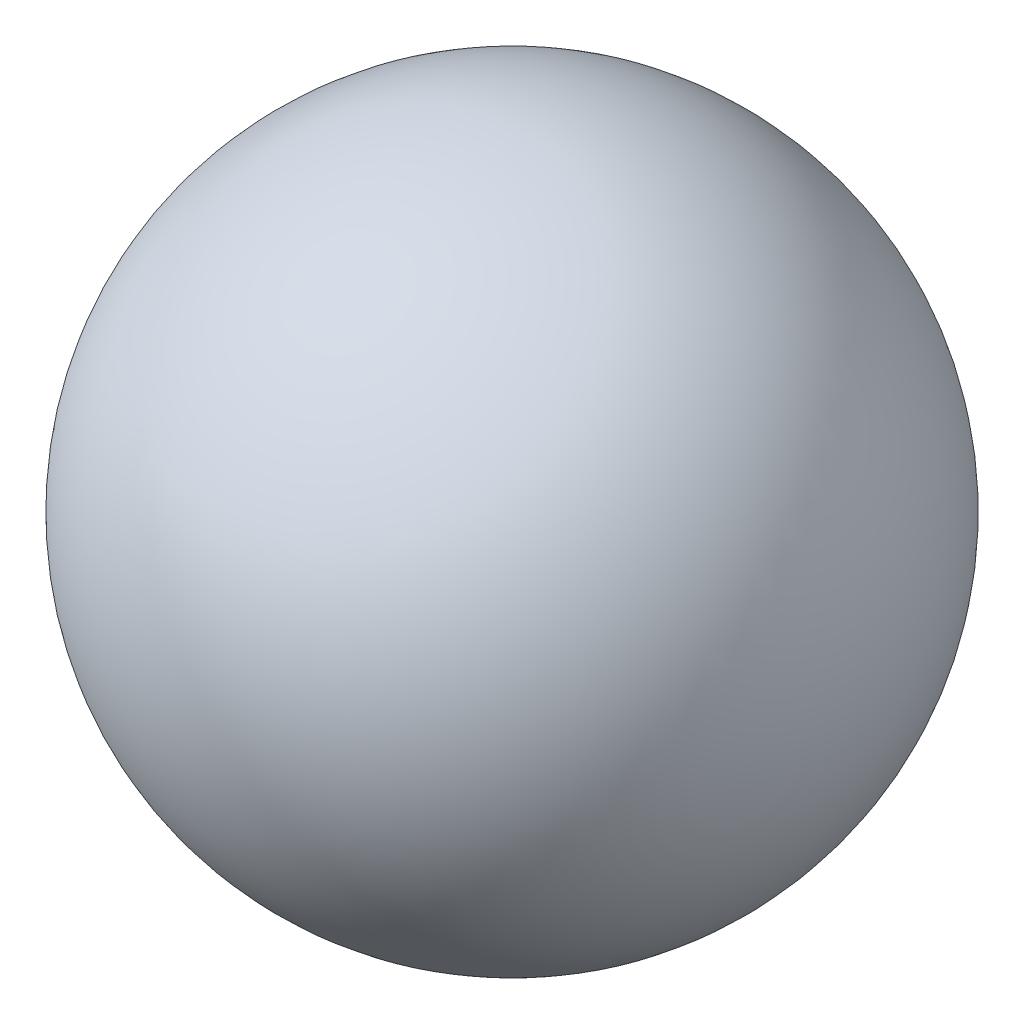
ISO-10303-21;
HEADER;
FILE_DESCRIPTION(('STEP AP214'),'2;1');
FILE_NAME('part.step','',(''),(''),'','','');
FILE_SCHEMA(('AUTOMOTIVE_DESIGN { 1 0 10303 214 1 1 1 1 }'));
ENDSEC;
DATA;
#1=APPLICATION_CONTEXT('core data for automotive mechanical design processes');
#2=APPLICATION_PROTOCOL_DEFINITION('international standard','automotive_design',2000,#1);
#3=PRODUCT_CONTEXT('',#1,'mechanical');
#4=PRODUCT('Part','Part','',(#3));
#5=PRODUCT_RELATED_PRODUCT_CATEGORY('part','',(#4));
#6=PRODUCT_DEFINITION_FORMATION('','',#4);
#7=PRODUCT_DEFINITION_CONTEXT('part definition',#1,'design');
#8=PRODUCT_DEFINITION('design','',#6,#7);
#9=PRODUCT_DEFINITION_SHAPE('','',#8);
#10=(LENGTH_UNIT() NAMED_UNIT(*) SI_UNIT(.MILLI.,.METRE.));
#11=(NAMED_UNIT(*) PLANE_ANGLE_UNIT() SI_UNIT($,.RADIAN.));
#12=(NAMED_UNIT(*) SI_UNIT($,.STERADIAN.) SOLID_ANGLE_UNIT());
#13=UNCERTAINTY_MEASURE_WITH_UNIT(LENGTH_MEASURE(1.E-05),#10,'distance_accuracy_value','');
#14=(GEOMETRIC_REPRESENTATION_CONTEXT(3) GLOBAL_UNCERTAINTY_ASSIGNED_CONTEXT((#13)) GLOBAL_UNIT_ASSIGNED_CONTEXT((#10,
#11,#12)) REPRESENTATION_CONTEXT('',''));
#15=CARTESIAN_POINT('',(0.,0.,0.));
#16=DIRECTION('',(0.,0.,1.));
#17=DIRECTION('',(1.,0.,0.));
#18=AXIS2_PLACEMENT_3D('',#15,#16,#17);
#19=CARTESIAN_POINT('',(0.,0.,0.));
#20=DIRECTION('',(0.,1.,0.));
#21=DIRECTION('',(1.,0.,0.));
#22=AXIS2_PLACEMENT_3D('',#19,#20,#21);
#23=SPHERICAL_SURFACE('',#22,95.);
#24=CARTESIAN_POINT('',(0.,95.,0.));
#25=VERTEX_POINT('',#24);
#26=VERTEX_LOOP('',#25);
#27=FACE_BOUND('',#26,.T.);
#28=ADVANCED_FACE('F39',(#27),#23,.T.);
#29=CLOSED_SHELL('',(#28));
#30=MANIFOLD_SOLID_BREP('B2',#29);
#31=ADVANCED_BREP_SHAPE_REPRESENTATION('',(#18,#30),#14);
#32=SHAPE_DEFINITION_REPRESENTATION(#9,#31);
ENDSEC;
END-ISO-10303-21;
